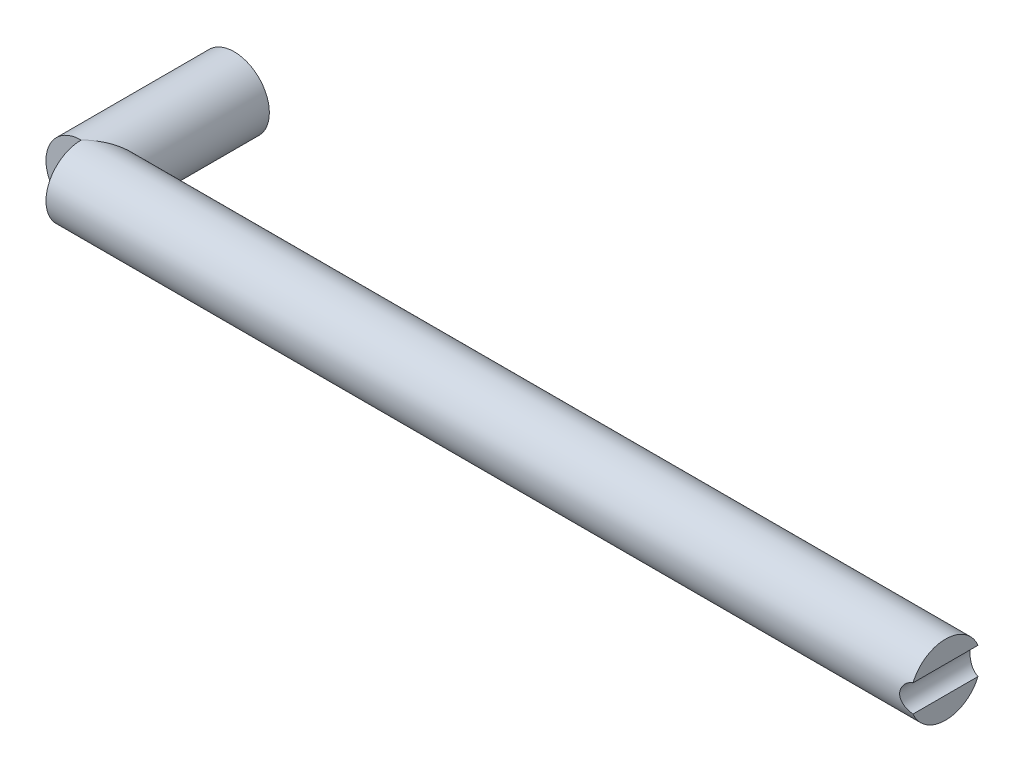
ISO-10303-21;
HEADER;
FILE_DESCRIPTION(('STEP AP214'),'2;1');
FILE_NAME('part.step','',(''),(''),'','','');
FILE_SCHEMA(('AUTOMOTIVE_DESIGN { 1 0 10303 214 1 1 1 1 }'));
ENDSEC;
DATA;
#1=APPLICATION_CONTEXT('core data for automotive mechanical design processes');
#2=APPLICATION_PROTOCOL_DEFINITION('international standard','automotive_design',2000,#1);
#3=PRODUCT_CONTEXT('',#1,'mechanical');
#4=PRODUCT('Part','Part','',(#3));
#5=PRODUCT_RELATED_PRODUCT_CATEGORY('part','',(#4));
#6=PRODUCT_DEFINITION_FORMATION('','',#4);
#7=PRODUCT_DEFINITION_CONTEXT('part definition',#1,'design');
#8=PRODUCT_DEFINITION('design','',#6,#7);
#9=PRODUCT_DEFINITION_SHAPE('','',#8);
#10=(LENGTH_UNIT() NAMED_UNIT(*) SI_UNIT(.MILLI.,.METRE.));
#11=(NAMED_UNIT(*) PLANE_ANGLE_UNIT() SI_UNIT($,.RADIAN.));
#12=(NAMED_UNIT(*) SI_UNIT($,.STERADIAN.) SOLID_ANGLE_UNIT());
#13=UNCERTAINTY_MEASURE_WITH_UNIT(LENGTH_MEASURE(1.E-05),#10,'distance_accuracy_value','');
#14=(GEOMETRIC_REPRESENTATION_CONTEXT(3) GLOBAL_UNCERTAINTY_ASSIGNED_CONTEXT((#13)) GLOBAL_UNIT_ASSIGNED_CONTEXT((#10,
#11,#12)) REPRESENTATION_CONTEXT('',''));
#15=CARTESIAN_POINT('',(0.,0.,0.));
#16=DIRECTION('',(0.,0.,1.));
#17=DIRECTION('',(1.,0.,0.));
#18=AXIS2_PLACEMENT_3D('',#15,#16,#17);
#19=CARTESIAN_POINT('',(565.,0.,0.));
#20=DIRECTION('',(-1.,0.,0.));
#21=DIRECTION('',(0.,0.,-1.));
#22=AXIS2_PLACEMENT_3D('',#19,#20,#21);
#23=CYLINDRICAL_SURFACE('',#22,23.);
#24=CARTESIAN_POINT('',(0.,0.,0.));
#25=DIRECTION('',(0.707106781186547,0.,0.707106781186547));
#26=DIRECTION('',(-0.707106781186547,0.,0.707106781186547));
#27=AXIS2_PLACEMENT_3D('',#24,#25,#26);
#28=ELLIPSE('',#27,32.5269119345812,23.);
#29=CARTESIAN_POINT('',(0.,-23.,0.));
#30=VERTEX_POINT('',#29);
#31=CARTESIAN_POINT('',(0.,23.,0.));
#32=VERTEX_POINT('',#31);
#33=EDGE_CURVE('E87',#30,#32,#28,.T.);
#34=ORIENTED_EDGE('',*,*,#33,.T.);
#35=CARTESIAN_POINT('',(0.,0.,0.));
#36=DIRECTION('',(-1.,0.,0.));
#37=DIRECTION('',(0.,0.,1.));
#38=AXIS2_PLACEMENT_3D('',#35,#36,#37);
#39=CIRCLE('',#38,23.);
#40=EDGE_CURVE('E84',#30,#32,#39,.T.);
#41=ORIENTED_EDGE('',*,*,#40,.F.);
#42=EDGE_LOOP('',(#34,#41));
#43=FACE_BOUND('',#42,.T.);
#44=CARTESIAN_POINT('',(565.,-8.83177774327774,-21.236753562947));
#45=CARTESIAN_POINT('',(564.751631758851,-8.77355780864955,-21.2609411154261));
#46=CARTESIAN_POINT('',(564.506163594028,-8.70490790513002,-21.2892346345712));
#47=CARTESIAN_POINT('',(564.022791575723,-8.54760662503701,-21.3528894008701));
#48=CARTESIAN_POINT('',(563.784884078797,-8.4589650543499,-21.3882471820456));
#49=CARTESIAN_POINT('',(563.318734290578,-8.26272576785685,-21.4648163787728));
#50=CARTESIAN_POINT('',(563.090469335564,-8.1551759681116,-21.5060129480534));
#51=CARTESIAN_POINT('',(562.644346482659,-7.92186711084832,-21.5930437221196));
#52=CARTESIAN_POINT('',(562.42648974407,-7.7961060311566,-21.6388784417532));
#53=CARTESIAN_POINT('',(562.002828375489,-7.52754398256879,-21.7337598266207));
#54=CARTESIAN_POINT('',(561.797004025371,-7.38477213058012,-21.7828009404095));
#55=CARTESIAN_POINT('',(561.398079844108,-7.08291370698792,-21.8828155845874));
#56=CARTESIAN_POINT('',(561.204984395543,-6.92382156397889,-21.9337897711186));
#57=CARTESIAN_POINT('',(560.832566915405,-6.59023744179139,-22.0363160871739));
#58=CARTESIAN_POINT('',(560.653252058117,-6.41573754144253,-22.0878685019378));
#59=CARTESIAN_POINT('',(560.309531819447,-6.05239770968698,-22.1901802735044));
#60=CARTESIAN_POINT('',(560.145126975128,-5.86355726218063,-22.2409396016854));
#61=CARTESIAN_POINT('',(559.826190455125,-5.46502392949975,-22.3422781835907));
#62=CARTESIAN_POINT('',(559.672286125055,-5.25480714852089,-22.3927746236614));
#63=CARTESIAN_POINT('',(559.382835620718,-4.82139600093398,-22.4900743289765));
#64=CARTESIAN_POINT('',(559.247282629288,-4.59820649771998,-22.5368789629426));
#65=CARTESIAN_POINT('',(558.995571276319,-4.14020927300896,-22.6254957511936));
#66=CARTESIAN_POINT('',(558.879411580353,-3.90540235233303,-22.6673082489243));
#67=CARTESIAN_POINT('',(558.667528966972,-3.42575678508625,-22.7447397747402));
#68=CARTESIAN_POINT('',(558.571805088525,-3.18091861089959,-22.7803590940567));
#69=CARTESIAN_POINT('',(558.404454904288,-2.69093152741043,-22.8433347485432));
#70=CARTESIAN_POINT('',(558.33215824539,-2.4460408400798,-22.8709181100274));
#71=CARTESIAN_POINT('',(558.208349075951,-1.95033246701191,-22.9185119120335));
#72=CARTESIAN_POINT('',(558.156836220819,-1.69951487961443,-22.9385224781105));
#73=CARTESIAN_POINT('',(558.075172446681,-1.19400722519765,-22.9703822125134));
#74=CARTESIAN_POINT('',(558.045013478391,-0.939318654352761,-22.9822344560478));
#75=CARTESIAN_POINT('',(558.006372182166,-0.428054087629004,-22.9974381372382));
#76=CARTESIAN_POINT('',(557.997888795177,-0.171478184578307,-23.0007899902178));
#77=CARTESIAN_POINT('',(558.002542657474,0.325476594805685,-22.9989549649301));
#78=CARTESIAN_POINT('',(558.014368663245,0.565870839816723,-22.9942859360369));
#79=CARTESIAN_POINT('',(558.057043519532,1.04469309931983,-22.9775106766532));
#80=CARTESIAN_POINT('',(558.087891471246,1.28312120617406,-22.9654047975598));
#81=CARTESIAN_POINT('',(558.168300738171,1.75631449759641,-22.9340704785625));
#82=CARTESIAN_POINT('',(558.21786173627,1.99107974416532,-22.9148421593559));
#83=CARTESIAN_POINT('',(558.335224106901,2.45535221589369,-22.8697539710555));
#84=CARTESIAN_POINT('',(558.403025814807,2.68485934429262,-22.8438939800314));
#85=CARTESIAN_POINT('',(558.556094451926,3.13663590346848,-22.7862516837136));
#86=CARTESIAN_POINT('',(558.641323195293,3.35891994774001,-22.7544823404159));
#87=CARTESIAN_POINT('',(558.828663911682,3.79550407378686,-22.6857445178547));
#88=CARTESIAN_POINT('',(558.930781587483,4.00980142869627,-22.6487742830719));
#89=CARTESIAN_POINT('',(559.151120693167,4.4291450746624,-22.5705156484914));
#90=CARTESIAN_POINT('',(559.269343595399,4.63419051762057,-22.529226853969));
#91=CARTESIAN_POINT('',(559.521082257977,5.03393276897829,-22.44329133345));
#92=CARTESIAN_POINT('',(559.65459889381,5.22862898400367,-22.3986444152687));
#93=CARTESIAN_POINT('',(559.944535450304,5.61801558856251,-22.304268657451));
#94=CARTESIAN_POINT('',(560.101848334894,5.81200666458183,-22.2543956088098));
#95=CARTESIAN_POINT('',(560.431676683175,6.1861186001173,-22.1533175740573));
#96=CARTESIAN_POINT('',(560.604187901877,6.36624330642393,-22.1021129626583));
#97=CARTESIAN_POINT('',(560.96345221218,6.71169073515121,-21.9996743163691));
#98=CARTESIAN_POINT('',(561.150205830954,6.87701290917282,-21.9484402804594));
#99=CARTESIAN_POINT('',(561.536919040162,7.19189292136034,-21.8472888347714));
#100=CARTESIAN_POINT('',(561.736879857554,7.34144929151269,-21.7973715479244));
#101=CARTESIAN_POINT('',(562.171978051901,7.63965121278344,-21.6947761331643));
#102=CARTESIAN_POINT('',(562.408548054723,7.78632287593001,-21.6424139359999));
#103=CARTESIAN_POINT('',(562.894991873453,8.05770275017248,-21.5428480407523));
#104=CARTESIAN_POINT('',(563.14486520876,8.18241175399882,-21.4956441565059));
#105=CARTESIAN_POINT('',(563.656901362534,8.40898235403076,-21.408034502671));
#106=CARTESIAN_POINT('',(563.919100269483,8.51077106100109,-21.3676505201939));
#107=CARTESIAN_POINT('',(564.45300225759,8.68991550541043,-21.2954058778142));
#108=CARTESIAN_POINT('',(564.724710467248,8.76725782580683,-21.2635498998452));
#109=CARTESIAN_POINT('',(565.,8.83177774327774,-21.236753562947));
#110=B_SPLINE_CURVE_WITH_KNOTS('',3,(#44,#45,#46,#47,#48,#49,#50,#51,#52,#53,#54,#55,#56,#57,
#58,#59,#60,#61,#62,#63,#64,#65,#66,#67,#68,#69,#70,#71,#72,#73,#74,#75,#76,#77,#78,#79,#80,#81,
#82,#83,#84,#85,#86,#87,#88,#89,#90,#91,#92,#93,#94,#95,#96,#97,#98,#99,#100,#101,#102,#103,
#104,#105,#106,#107,#108,#109),.UNSPECIFIED.,.F.,.F.,(4,2,2,2,2,2,2,2,2,2,2,2,2,2,2,2,2,2,2,2,2,
2,2,2,2,2,2,2,2,2,2,2,4),(0.,0.768398374985054,1.53642066812511,2.3025240264119,
3.06871251785102,3.83360789203819,4.59876525996892,5.36431831363266,6.12989893173139,
6.92507452896006,7.71995391876642,8.51477859144579,9.30956587776821,10.0790414022761,
10.8485041685136,11.6176767334035,12.3868117162946,13.1081341484491,13.8294225001693,
14.5506986294524,15.2719880211024,15.9917135532381,16.7116826084859,17.4317175278872,
18.1517936861426,18.9150145218996,19.6780228571334,20.4410594483467,21.2041670261391,
22.0526503771899,22.901103096408,23.7522170414372,24.6037973000834),.UNSPECIFIED.);
#111=CARTESIAN_POINT('',(565.,-8.83177774327774,-21.236753562947));
#112=VERTEX_POINT('',#111);
#113=CARTESIAN_POINT('',(565.,8.83177774327774,-21.236753562947));
#114=VERTEX_POINT('',#113);
#115=EDGE_CURVE('E76',#112,#114,#110,.T.);
#116=ORIENTED_EDGE('',*,*,#115,.F.);
#117=CARTESIAN_POINT('',(565.,0.,0.));
#118=DIRECTION('',(-1.,0.,0.));
#119=DIRECTION('',(0.,0.,1.));
#120=AXIS2_PLACEMENT_3D('',#117,#118,#119);
#121=CIRCLE('',#120,23.);
#122=CARTESIAN_POINT('',(565.,-8.83177774327774,21.236753562947));
#123=VERTEX_POINT('',#122);
#124=EDGE_CURVE('E74',#112,#123,#121,.T.);
#125=ORIENTED_EDGE('',*,*,#124,.T.);
#126=CARTESIAN_POINT('',(565.,-8.83177774327774,21.236753562947));
#127=CARTESIAN_POINT('',(564.751631758851,-8.77355780864955,21.2609411154261));
#128=CARTESIAN_POINT('',(564.506163594028,-8.70490790513002,21.2892346345712));
#129=CARTESIAN_POINT('',(564.022791575723,-8.54760662503701,21.3528894008701));
#130=CARTESIAN_POINT('',(563.784884078797,-8.4589650543499,21.3882471820456));
#131=CARTESIAN_POINT('',(563.318734290578,-8.26272576785685,21.4648163787728));
#132=CARTESIAN_POINT('',(563.090469335564,-8.1551759681116,21.5060129480534));
#133=CARTESIAN_POINT('',(562.644346482659,-7.92186711084832,21.5930437221196));
#134=CARTESIAN_POINT('',(562.42648974407,-7.7961060311566,21.6388784417532));
#135=CARTESIAN_POINT('',(562.002828375489,-7.52754398256879,21.7337598266207));
#136=CARTESIAN_POINT('',(561.797004025371,-7.38477213058012,21.7828009404095));
#137=CARTESIAN_POINT('',(561.398079844108,-7.08291370698792,21.8828155845874));
#138=CARTESIAN_POINT('',(561.204984395543,-6.92382156397889,21.9337897711186));
#139=CARTESIAN_POINT('',(560.832566915405,-6.59023744179139,22.0363160871739));
#140=CARTESIAN_POINT('',(560.653252058117,-6.41573754144253,22.0878685019378));
#141=CARTESIAN_POINT('',(560.309531819447,-6.05239770968698,22.1901802735044));
#142=CARTESIAN_POINT('',(560.145126975128,-5.86355726218063,22.2409396016854));
#143=CARTESIAN_POINT('',(559.826190455125,-5.46502392949975,22.3422781835907));
#144=CARTESIAN_POINT('',(559.672286125055,-5.25480714852089,22.3927746236614));
#145=CARTESIAN_POINT('',(559.382835620718,-4.82139600093398,22.4900743289765));
#146=CARTESIAN_POINT('',(559.247282629288,-4.59820649771998,22.5368789629426));
#147=CARTESIAN_POINT('',(558.995571276319,-4.14020927300896,22.6254957511936));
#148=CARTESIAN_POINT('',(558.879411580353,-3.90540235233303,22.6673082489243));
#149=CARTESIAN_POINT('',(558.667528966972,-3.42575678508625,22.7447397747402));
#150=CARTESIAN_POINT('',(558.571805088525,-3.18091861089959,22.7803590940567));
#151=CARTESIAN_POINT('',(558.404454904288,-2.69093152741043,22.8433347485432));
#152=CARTESIAN_POINT('',(558.33215824539,-2.4460408400798,22.8709181100274));
#153=CARTESIAN_POINT('',(558.208349075951,-1.95033246701191,22.9185119120335));
#154=CARTESIAN_POINT('',(558.156836220819,-1.69951487961443,22.9385224781105));
#155=CARTESIAN_POINT('',(558.075172446681,-1.19400722519765,22.9703822125134));
#156=CARTESIAN_POINT('',(558.045013478391,-0.939318654352761,22.9822344560478));
#157=CARTESIAN_POINT('',(558.006372182166,-0.428054087629004,22.9974381372382));
#158=CARTESIAN_POINT('',(557.997888795177,-0.171478184578307,23.0007899902178));
#159=CARTESIAN_POINT('',(558.002542657474,0.325476594805685,22.9989549649301));
#160=CARTESIAN_POINT('',(558.014368663245,0.565870839816723,22.9942859360369));
#161=CARTESIAN_POINT('',(558.057043519532,1.04469309931983,22.9775106766532));
#162=CARTESIAN_POINT('',(558.087891471246,1.28312120617406,22.9654047975598));
#163=CARTESIAN_POINT('',(558.168300738171,1.75631449759641,22.9340704785625));
#164=CARTESIAN_POINT('',(558.21786173627,1.99107974416532,22.9148421593559));
#165=CARTESIAN_POINT('',(558.335224106901,2.45535221589369,22.8697539710555));
#166=CARTESIAN_POINT('',(558.403025814807,2.68485934429262,22.8438939800314));
#167=CARTESIAN_POINT('',(558.556094451926,3.13663590346848,22.7862516837136));
#168=CARTESIAN_POINT('',(558.641323195293,3.35891994774001,22.7544823404159));
#169=CARTESIAN_POINT('',(558.828663911682,3.79550407378686,22.6857445178547));
#170=CARTESIAN_POINT('',(558.930781587483,4.00980142869627,22.6487742830719));
#171=CARTESIAN_POINT('',(559.151120693167,4.4291450746624,22.5705156484914));
#172=CARTESIAN_POINT('',(559.269343595399,4.63419051762057,22.529226853969));
#173=CARTESIAN_POINT('',(559.521082257977,5.03393276897829,22.44329133345));
#174=CARTESIAN_POINT('',(559.65459889381,5.22862898400367,22.3986444152687));
#175=CARTESIAN_POINT('',(559.944535450304,5.61801558856251,22.304268657451));
#176=CARTESIAN_POINT('',(560.101848334894,5.81200666458183,22.2543956088098));
#177=CARTESIAN_POINT('',(560.431676683175,6.1861186001173,22.1533175740573));
#178=CARTESIAN_POINT('',(560.604187901877,6.36624330642393,22.1021129626583));
#179=CARTESIAN_POINT('',(560.96345221218,6.71169073515121,21.9996743163691));
#180=CARTESIAN_POINT('',(561.150205830954,6.87701290917282,21.9484402804594));
#181=CARTESIAN_POINT('',(561.536919040162,7.19189292136034,21.8472888347714));
#182=CARTESIAN_POINT('',(561.736879857554,7.34144929151269,21.7973715479244));
#183=CARTESIAN_POINT('',(562.171978051901,7.63965121278344,21.6947761331643));
#184=CARTESIAN_POINT('',(562.408548054723,7.78632287593001,21.6424139359999));
#185=CARTESIAN_POINT('',(562.894991873453,8.05770275017248,21.5428480407523));
#186=CARTESIAN_POINT('',(563.14486520876,8.18241175399882,21.4956441565059));
#187=CARTESIAN_POINT('',(563.656901362534,8.40898235403076,21.408034502671));
#188=CARTESIAN_POINT('',(563.919100269483,8.51077106100109,21.3676505201939));
#189=CARTESIAN_POINT('',(564.45300225759,8.68991550541043,21.2954058778142));
#190=CARTESIAN_POINT('',(564.724710467248,8.76725782580683,21.2635498998452));
#191=CARTESIAN_POINT('',(565.,8.83177774327774,21.236753562947));
#192=B_SPLINE_CURVE_WITH_KNOTS('',3,(#126,#127,#128,#129,#130,#131,#132,#133,#134,#135,#136,
#137,#138,#139,#140,#141,#142,#143,#144,#145,#146,#147,#148,#149,#150,#151,#152,#153,#154,#155,
#156,#157,#158,#159,#160,#161,#162,#163,#164,#165,#166,#167,#168,#169,#170,#171,#172,#173,#174,
#175,#176,#177,#178,#179,#180,#181,#182,#183,#184,#185,#186,#187,#188,#189,#190,#191),
.UNSPECIFIED.,.F.,.F.,(4,2,2,2,2,2,2,2,2,2,2,2,2,2,2,2,2,2,2,2,2,2,2,2,2,2,2,2,2,2,2,2,4),(0.,
0.768398374985054,1.53642066812511,2.3025240264119,3.06871251785102,3.83360789203819,
4.59876525996892,5.36431831363266,6.12989893173139,6.92507452896006,7.71995391876642,
8.51477859144579,9.30956587776821,10.0790414022761,10.8485041685136,11.6176767334035,
12.3868117162946,13.1081341484491,13.8294225001693,14.5506986294524,15.2719880211024,
15.9917135532381,16.7116826084859,17.4317175278872,18.1517936861426,18.9150145218996,
19.6780228571334,20.4410594483467,21.2041670261391,22.0526503771899,22.901103096408,
23.7522170414372,24.6037973000834),.UNSPECIFIED.);
#193=CARTESIAN_POINT('',(565.,8.83177774327774,21.236753562947));
#194=VERTEX_POINT('',#193);
#195=EDGE_CURVE('E79',#123,#194,#192,.T.);
#196=ORIENTED_EDGE('',*,*,#195,.T.);
#197=EDGE_CURVE('E44',#194,#114,#121,.T.);
#198=ORIENTED_EDGE('',*,*,#197,.T.);
#199=EDGE_LOOP('',(#116,#125,#196,#198));
#200=FACE_BOUND('',#199,.T.);
#201=ADVANCED_FACE('F37',(#43,#200),#23,.T.);
#202=CARTESIAN_POINT('',(565.,0.,0.));
#203=DIRECTION('',(1.,0.,0.));
#204=DIRECTION('',(0.,0.,1.));
#205=AXIS2_PLACEMENT_3D('',#202,#203,#204);
#206=PLANE('',#205);
#207=ORIENTED_EDGE('',*,*,#124,.F.);
#208=DIRECTION('',(0.,0.,1.));
#209=VECTOR('',#208,1.);
#210=CARTESIAN_POINT('',(565.,-8.83177774327774,-100.001));
#211=LINE('',#210,#209);
#212=EDGE_CURVE('E71',#112,#123,#211,.T.);
#213=ORIENTED_EDGE('',*,*,#212,.T.);
#214=EDGE_LOOP('',(#207,#213));
#215=FACE_BOUND('',#214,.T.);
#216=ADVANCED_FACE('F72',(#215),#206,.T.);
#217=ORIENTED_EDGE('',*,*,#197,.F.);
#218=DIRECTION('',(0.,0.,1.));
#219=VECTOR('',#218,1.);
#220=CARTESIAN_POINT('',(565.,8.83177774327774,-100.001));
#221=LINE('',#220,#219);
#222=EDGE_CURVE('E51',#194,#114,#221,.F.);
#223=ORIENTED_EDGE('',*,*,#222,.T.);
#224=EDGE_LOOP('',(#217,#223));
#225=FACE_BOUND('',#224,.T.);
#226=ADVANCED_FACE('F121',(#225),#206,.T.);
#227=CARTESIAN_POINT('',(0.,0.,0.));
#228=DIRECTION('',(1.,0.,0.));
#229=DIRECTION('',(0.,0.,1.));
#230=AXIS2_PLACEMENT_3D('',#227,#228,#229);
#231=PLANE('',#230);
#232=DIRECTION('',(0.,-1.,0.));
#233=VECTOR('',#232,1.);
#234=CARTESIAN_POINT('',(0.,0.,0.));
#235=LINE('',#234,#233);
#236=EDGE_CURVE('E11',#32,#30,#235,.T.);
#237=ORIENTED_EDGE('',*,*,#236,.T.);
#238=ORIENTED_EDGE('',*,*,#40,.T.);
#239=EDGE_LOOP('',(#237,#238));
#240=FACE_BOUND('',#239,.T.);
#241=ADVANCED_FACE('F118',(#240),#231,.F.);
#242=CARTESIAN_POINT('',(0.,0.,-100.));
#243=DIRECTION('',(0.,0.,1.));
#244=DIRECTION('',(-1.,0.,0.));
#245=AXIS2_PLACEMENT_3D('',#242,#243,#244);
#246=CYLINDRICAL_SURFACE('',#245,23.);
#247=CARTESIAN_POINT('',(0.,0.,-100.));
#248=DIRECTION('',(0.,0.,1.));
#249=DIRECTION('',(1.,0.,0.));
#250=AXIS2_PLACEMENT_3D('',#247,#248,#249);
#251=CIRCLE('',#250,23.);
#252=CARTESIAN_POINT('',(23.,0.,-100.));
#253=VERTEX_POINT('',#252);
#254=EDGE_CURVE('E91',#253,#253,#251,.T.);
#255=ORIENTED_EDGE('',*,*,#254,.T.);
#256=EDGE_LOOP('',(#255));
#257=FACE_BOUND('',#256,.T.);
#258=CARTESIAN_POINT('',(0.,0.,0.));
#259=DIRECTION('',(0.,0.,1.));
#260=DIRECTION('',(1.,0.,0.));
#261=AXIS2_PLACEMENT_3D('',#258,#259,#260);
#262=CIRCLE('',#261,23.);
#263=EDGE_CURVE('E58',#32,#30,#262,.T.);
#264=ORIENTED_EDGE('',*,*,#263,.F.);
#265=ORIENTED_EDGE('',*,*,#33,.F.);
#266=EDGE_LOOP('',(#264,#265));
#267=FACE_BOUND('',#266,.T.);
#268=ADVANCED_FACE('F114',(#257,#267),#246,.T.);
#269=CARTESIAN_POINT('',(0.,0.,0.));
#270=DIRECTION('',(0.,0.,-1.));
#271=DIRECTION('',(1.,0.,0.));
#272=AXIS2_PLACEMENT_3D('',#269,#270,#271);
#273=PLANE('',#272);
#274=ORIENTED_EDGE('',*,*,#263,.T.);
#275=ORIENTED_EDGE('',*,*,#236,.F.);
#276=EDGE_LOOP('',(#274,#275));
#277=FACE_BOUND('',#276,.T.);
#278=ADVANCED_FACE('F110',(#277),#273,.F.);
#279=CARTESIAN_POINT('',(0.,0.,-100.));
#280=DIRECTION('',(0.,0.,-1.));
#281=DIRECTION('',(1.,0.,0.));
#282=AXIS2_PLACEMENT_3D('',#279,#280,#281);
#283=PLANE('',#282);
#284=ORIENTED_EDGE('',*,*,#254,.F.);
#285=EDGE_LOOP('',(#284));
#286=FACE_BOUND('',#285,.T.);
#287=ADVANCED_FACE('F107',(#286),#283,.T.);
#288=CARTESIAN_POINT('',(567.071310443623,0.,-100.001));
#289=DIRECTION('',(0.,0.,1.));
#290=DIRECTION('',(-1.,0.,0.));
#291=AXIS2_PLACEMENT_3D('',#288,#289,#290);
#292=CYLINDRICAL_SURFACE('',#291,9.07141802920131);
#293=ORIENTED_EDGE('',*,*,#212,.F.);
#294=ORIENTED_EDGE('',*,*,#115,.T.);
#295=ORIENTED_EDGE('',*,*,#222,.F.);
#296=ORIENTED_EDGE('',*,*,#195,.F.);
#297=EDGE_LOOP('',(#293,#294,#295,#296));
#298=FACE_BOUND('',#297,.T.);
#299=ADVANCED_FACE('F80',(#298),#292,.F.);
#300=CLOSED_SHELL('',(#201,#216,#226,#241,#268,#278,#287,#299));
#301=MANIFOLD_SOLID_BREP('B2',#300);
#302=ADVANCED_BREP_SHAPE_REPRESENTATION('',(#18,#301),#14);
#303=SHAPE_DEFINITION_REPRESENTATION(#9,#302);
ENDSEC;
END-ISO-10303-21;
